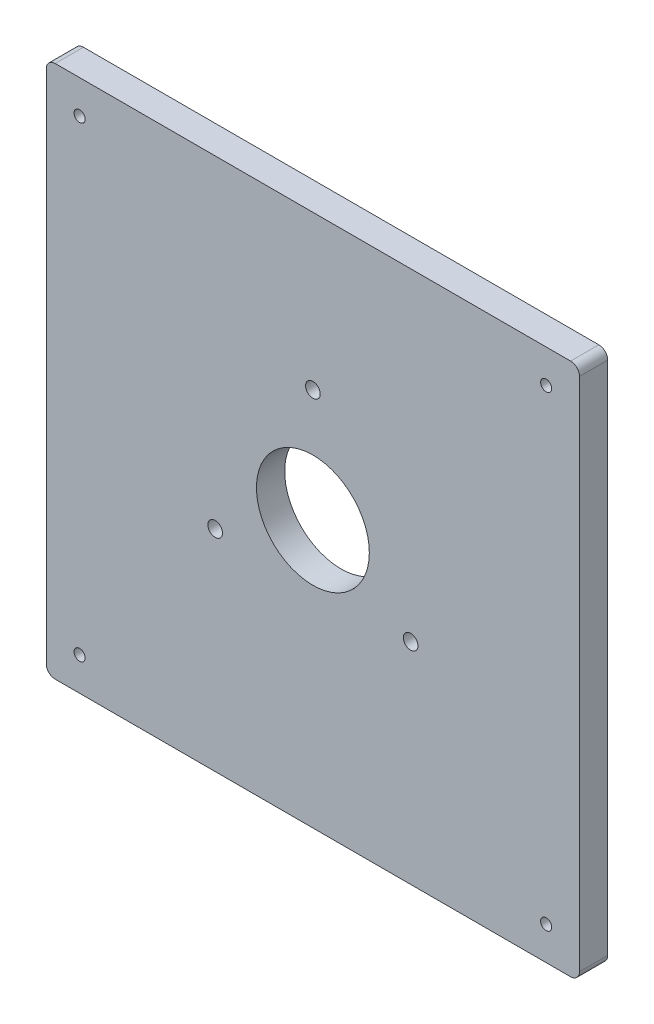
ISO-10303-21;
HEADER;
FILE_DESCRIPTION(('STEP AP214'),'2;1');
FILE_NAME('part.step','',(''),(''),'','','');
FILE_SCHEMA(('AUTOMOTIVE_DESIGN { 1 0 10303 214 1 1 1 1 }'));
ENDSEC;
DATA;
#1=APPLICATION_CONTEXT('core data for automotive mechanical design processes');
#2=APPLICATION_PROTOCOL_DEFINITION('international standard','automotive_design',2000,#1);
#3=PRODUCT_CONTEXT('',#1,'mechanical');
#4=PRODUCT('Part','Part','',(#3));
#5=PRODUCT_RELATED_PRODUCT_CATEGORY('part','',(#4));
#6=PRODUCT_DEFINITION_FORMATION('','',#4);
#7=PRODUCT_DEFINITION_CONTEXT('part definition',#1,'design');
#8=PRODUCT_DEFINITION('design','',#6,#7);
#9=PRODUCT_DEFINITION_SHAPE('','',#8);
#10=(LENGTH_UNIT() NAMED_UNIT(*) SI_UNIT(.MILLI.,.METRE.));
#11=(NAMED_UNIT(*) PLANE_ANGLE_UNIT() SI_UNIT($,.RADIAN.));
#12=(NAMED_UNIT(*) SI_UNIT($,.STERADIAN.) SOLID_ANGLE_UNIT());
#13=UNCERTAINTY_MEASURE_WITH_UNIT(LENGTH_MEASURE(1.E-05),#10,'distance_accuracy_value','');
#14=(GEOMETRIC_REPRESENTATION_CONTEXT(3) GLOBAL_UNCERTAINTY_ASSIGNED_CONTEXT((#13)) GLOBAL_UNIT_ASSIGNED_CONTEXT((#10,
#11,#12)) REPRESENTATION_CONTEXT('',''));
#15=CARTESIAN_POINT('',(0.,0.,0.));
#16=DIRECTION('',(0.,0.,1.));
#17=DIRECTION('',(1.,0.,0.));
#18=AXIS2_PLACEMENT_3D('',#15,#16,#17);
#19=CARTESIAN_POINT('',(0.,0.,6.35));
#20=DIRECTION('',(0.,0.,-1.));
#21=DIRECTION('',(-1.,0.,0.));
#22=AXIS2_PLACEMENT_3D('',#19,#20,#21);
#23=PLANE('',#22);
#24=CARTESIAN_POINT('',(81.9970452561247,47.2999999999999,6.35));
#25=DIRECTION('',(0.,0.,1.));
#26=DIRECTION('',(1.,0.,0.));
#27=AXIS2_PLACEMENT_3D('',#24,#25,#26);
#28=CIRCLE('',#27,1.65000000000001);
#29=CARTESIAN_POINT('',(83.6470452561247,47.2999999999999,6.35));
#30=VERTEX_POINT('',#29);
#31=EDGE_CURVE('E364',#30,#30,#28,.T.);
#32=ORIENTED_EDGE('',*,*,#31,.F.);
#33=EDGE_LOOP('',(#32));
#34=FACE_BOUND('',#33,.T.);
#35=CARTESIAN_POINT('',(38.0029547438753,47.2999999999999,6.35));
#36=DIRECTION('',(0.,0.,1.));
#37=DIRECTION('',(1.,0.,0.));
#38=AXIS2_PLACEMENT_3D('',#35,#36,#37);
#39=CIRCLE('',#38,1.65);
#40=CARTESIAN_POINT('',(39.6529547438753,47.2999999999999,6.35));
#41=VERTEX_POINT('',#40);
#42=EDGE_CURVE('E365',#41,#41,#39,.T.);
#43=ORIENTED_EDGE('',*,*,#42,.F.);
#44=EDGE_LOOP('',(#43));
#45=FACE_BOUND('',#44,.T.);
#46=CARTESIAN_POINT('',(60.,85.4,6.35));
#47=DIRECTION('',(0.,0.,1.));
#48=DIRECTION('',(1.,0.,0.));
#49=AXIS2_PLACEMENT_3D('',#46,#47,#48);
#50=CIRCLE('',#49,1.65);
#51=CARTESIAN_POINT('',(61.65,85.4,6.35));
#52=VERTEX_POINT('',#51);
#53=EDGE_CURVE('E373',#52,#52,#50,.T.);
#54=ORIENTED_EDGE('',*,*,#53,.F.);
#55=EDGE_LOOP('',(#54));
#56=FACE_BOUND('',#55,.T.);
#57=DIRECTION('',(0.,-1.,0.));
#58=VECTOR('',#57,1.);
#59=CARTESIAN_POINT('',(0.,0.,6.35));
#60=LINE('',#59,#58);
#61=CARTESIAN_POINT('',(0.,118.,6.35));
#62=VERTEX_POINT('',#61);
#63=CARTESIAN_POINT('',(0.,2.,6.35));
#64=VERTEX_POINT('',#63);
#65=EDGE_CURVE('E137',#62,#64,#60,.T.);
#66=ORIENTED_EDGE('',*,*,#65,.T.);
#67=CARTESIAN_POINT('',(2.,2.,6.35));
#68=DIRECTION('',(0.,0.,-1.));
#69=DIRECTION('',(-1.,0.,0.));
#70=AXIS2_PLACEMENT_3D('',#67,#68,#69);
#71=CIRCLE('',#70,2.);
#72=CARTESIAN_POINT('',(2.,0.,6.35));
#73=VERTEX_POINT('',#72);
#74=EDGE_CURVE('E152',#64,#73,#71,.F.);
#75=ORIENTED_EDGE('',*,*,#74,.T.);
#76=DIRECTION('',(1.,0.,0.));
#77=VECTOR('',#76,1.);
#78=CARTESIAN_POINT('',(0.,0.,6.35));
#79=LINE('',#78,#77);
#80=CARTESIAN_POINT('',(118.,0.,6.35));
#81=VERTEX_POINT('',#80);
#82=EDGE_CURVE('E119',#73,#81,#79,.T.);
#83=ORIENTED_EDGE('',*,*,#82,.T.);
#84=CARTESIAN_POINT('',(118.,2.,6.35));
#85=DIRECTION('',(0.,0.,-1.));
#86=DIRECTION('',(-1.,0.,0.));
#87=AXIS2_PLACEMENT_3D('',#84,#85,#86);
#88=CIRCLE('',#87,2.);
#89=CARTESIAN_POINT('',(120.,2.,6.35));
#90=VERTEX_POINT('',#89);
#91=EDGE_CURVE('E150',#81,#90,#88,.F.);
#92=ORIENTED_EDGE('',*,*,#91,.T.);
#93=DIRECTION('',(0.,1.,0.));
#94=VECTOR('',#93,1.);
#95=CARTESIAN_POINT('',(120.,0.,6.35));
#96=LINE('',#95,#94);
#97=CARTESIAN_POINT('',(120.,118.,6.35));
#98=VERTEX_POINT('',#97);
#99=EDGE_CURVE('E172',#90,#98,#96,.T.);
#100=ORIENTED_EDGE('',*,*,#99,.T.);
#101=CARTESIAN_POINT('',(118.,118.,6.35));
#102=DIRECTION('',(0.,0.,-1.));
#103=DIRECTION('',(-1.,0.,0.));
#104=AXIS2_PLACEMENT_3D('',#101,#102,#103);
#105=CIRCLE('',#104,2.);
#106=CARTESIAN_POINT('',(118.,120.,6.35));
#107=VERTEX_POINT('',#106);
#108=EDGE_CURVE('E54',#98,#107,#105,.F.);
#109=ORIENTED_EDGE('',*,*,#108,.T.);
#110=DIRECTION('',(-1.,0.,0.));
#111=VECTOR('',#110,1.);
#112=CARTESIAN_POINT('',(0.,120.,6.35));
#113=LINE('',#112,#111);
#114=CARTESIAN_POINT('',(2.,120.,6.35));
#115=VERTEX_POINT('',#114);
#116=EDGE_CURVE('E138',#107,#115,#113,.T.);
#117=ORIENTED_EDGE('',*,*,#116,.T.);
#118=CARTESIAN_POINT('',(2.,118.,6.35));
#119=DIRECTION('',(0.,0.,-1.));
#120=DIRECTION('',(-1.,0.,0.));
#121=AXIS2_PLACEMENT_3D('',#118,#119,#120);
#122=CIRCLE('',#121,2.);
#123=EDGE_CURVE('E148',#115,#62,#122,.F.);
#124=ORIENTED_EDGE('',*,*,#123,.T.);
#125=EDGE_LOOP('',(#66,#75,#83,#92,#100,#109,#117,#124));
#126=FACE_BOUND('',#125,.T.);
#127=CARTESIAN_POINT('',(7.5,112.5,6.35));
#128=DIRECTION('',(0.,0.,1.));
#129=DIRECTION('',(1.,0.,0.));
#130=AXIS2_PLACEMENT_3D('',#127,#128,#129);
#131=CIRCLE('',#130,1.25);
#132=CARTESIAN_POINT('',(8.75,112.5,6.35));
#133=VERTEX_POINT('',#132);
#134=EDGE_CURVE('E132',#133,#133,#131,.T.);
#135=ORIENTED_EDGE('',*,*,#134,.F.);
#136=EDGE_LOOP('',(#135));
#137=FACE_BOUND('',#136,.T.);
#138=CARTESIAN_POINT('',(112.5,112.5,6.35));
#139=DIRECTION('',(0.,0.,1.));
#140=DIRECTION('',(-1.,0.,0.));
#141=AXIS2_PLACEMENT_3D('',#138,#139,#140);
#142=CIRCLE('',#141,1.24999999999998);
#143=CARTESIAN_POINT('',(111.25,112.5,6.35));
#144=VERTEX_POINT('',#143);
#145=EDGE_CURVE('E188',#144,#144,#142,.T.);
#146=ORIENTED_EDGE('',*,*,#145,.F.);
#147=EDGE_LOOP('',(#146));
#148=FACE_BOUND('',#147,.T.);
#149=CARTESIAN_POINT('',(112.5,7.49999999999999,6.35));
#150=DIRECTION('',(0.,0.,1.));
#151=DIRECTION('',(1.,0.,0.));
#152=AXIS2_PLACEMENT_3D('',#149,#150,#151);
#153=CIRCLE('',#152,1.24999999999998);
#154=CARTESIAN_POINT('',(113.75,7.49999999999999,6.35));
#155=VERTEX_POINT('',#154);
#156=EDGE_CURVE('E192',#155,#155,#153,.T.);
#157=ORIENTED_EDGE('',*,*,#156,.F.);
#158=EDGE_LOOP('',(#157));
#159=FACE_BOUND('',#158,.T.);
#160=CARTESIAN_POINT('',(7.5,7.49999999999999,6.35));
#161=DIRECTION('',(0.,0.,1.));
#162=DIRECTION('',(-1.,0.,0.));
#163=AXIS2_PLACEMENT_3D('',#160,#161,#162);
#164=CIRCLE('',#163,1.25);
#165=CARTESIAN_POINT('',(6.25,7.49999999999999,6.35));
#166=VERTEX_POINT('',#165);
#167=EDGE_CURVE('E196',#166,#166,#164,.T.);
#168=ORIENTED_EDGE('',*,*,#167,.F.);
#169=EDGE_LOOP('',(#168));
#170=FACE_BOUND('',#169,.T.);
#171=CARTESIAN_POINT('',(60.,60.,6.35));
#172=DIRECTION('',(0.,0.,1.));
#173=DIRECTION('',(1.,0.,0.));
#174=AXIS2_PLACEMENT_3D('',#171,#172,#173);
#175=CIRCLE('',#174,12.7);
#176=CARTESIAN_POINT('',(72.7,60.,6.35));
#177=VERTEX_POINT('',#176);
#178=EDGE_CURVE('E199',#177,#177,#175,.T.);
#179=ORIENTED_EDGE('',*,*,#178,.F.);
#180=EDGE_LOOP('',(#179));
#181=FACE_BOUND('',#180,.T.);
#182=ADVANCED_FACE('F34',(#34,#45,#56,#126,#137,#148,#159,#170,#181),#23,.F.);
#183=CARTESIAN_POINT('',(0.,0.,0.));
#184=DIRECTION('',(0.,0.,-1.));
#185=DIRECTION('',(-1.,0.,0.));
#186=AXIS2_PLACEMENT_3D('',#183,#184,#185);
#187=PLANE('',#186);
#188=CARTESIAN_POINT('',(81.9970452561247,47.2999999999999,0.));
#189=DIRECTION('',(0.,0.,1.));
#190=DIRECTION('',(1.,0.,0.));
#191=AXIS2_PLACEMENT_3D('',#188,#189,#190);
#192=CIRCLE('',#191,1.65000000000001);
#193=CARTESIAN_POINT('',(83.6470452561247,47.2999999999999,0.));
#194=VERTEX_POINT('',#193);
#195=EDGE_CURVE('E207',#194,#194,#192,.T.);
#196=ORIENTED_EDGE('',*,*,#195,.T.);
#197=EDGE_LOOP('',(#196));
#198=FACE_BOUND('',#197,.T.);
#199=CARTESIAN_POINT('',(38.0029547438753,47.2999999999999,0.));
#200=DIRECTION('',(0.,0.,1.));
#201=DIRECTION('',(1.,0.,0.));
#202=AXIS2_PLACEMENT_3D('',#199,#200,#201);
#203=CIRCLE('',#202,1.65);
#204=CARTESIAN_POINT('',(39.6529547438753,47.2999999999999,0.));
#205=VERTEX_POINT('',#204);
#206=EDGE_CURVE('E369',#205,#205,#203,.T.);
#207=ORIENTED_EDGE('',*,*,#206,.T.);
#208=EDGE_LOOP('',(#207));
#209=FACE_BOUND('',#208,.T.);
#210=CARTESIAN_POINT('',(60.,85.4,0.));
#211=DIRECTION('',(0.,0.,1.));
#212=DIRECTION('',(1.,0.,0.));
#213=AXIS2_PLACEMENT_3D('',#210,#211,#212);
#214=CIRCLE('',#213,1.65);
#215=CARTESIAN_POINT('',(61.65,85.4,0.));
#216=VERTEX_POINT('',#215);
#217=EDGE_CURVE('E210',#216,#216,#214,.T.);
#218=ORIENTED_EDGE('',*,*,#217,.T.);
#219=EDGE_LOOP('',(#218));
#220=FACE_BOUND('',#219,.T.);
#221=CARTESIAN_POINT('',(7.5,7.49999999999999,0.));
#222=DIRECTION('',(0.,0.,1.));
#223=DIRECTION('',(-1.,0.,0.));
#224=AXIS2_PLACEMENT_3D('',#221,#222,#223);
#225=CIRCLE('',#224,1.25);
#226=CARTESIAN_POINT('',(6.25,7.49999999999999,0.));
#227=VERTEX_POINT('',#226);
#228=EDGE_CURVE('E201',#227,#227,#225,.T.);
#229=ORIENTED_EDGE('',*,*,#228,.T.);
#230=EDGE_LOOP('',(#229));
#231=FACE_BOUND('',#230,.T.);
#232=CARTESIAN_POINT('',(112.5,112.5,0.));
#233=DIRECTION('',(0.,0.,1.));
#234=DIRECTION('',(-1.,0.,0.));
#235=AXIS2_PLACEMENT_3D('',#232,#233,#234);
#236=CIRCLE('',#235,1.24999999999998);
#237=CARTESIAN_POINT('',(111.25,112.5,0.));
#238=VERTEX_POINT('',#237);
#239=EDGE_CURVE('E216',#238,#238,#236,.T.);
#240=ORIENTED_EDGE('',*,*,#239,.T.);
#241=EDGE_LOOP('',(#240));
#242=FACE_BOUND('',#241,.T.);
#243=DIRECTION('',(1.,0.,0.));
#244=VECTOR('',#243,1.);
#245=CARTESIAN_POINT('',(0.,0.,0.));
#246=LINE('',#245,#244);
#247=CARTESIAN_POINT('',(2.,0.,0.));
#248=VERTEX_POINT('',#247);
#249=CARTESIAN_POINT('',(118.,0.,0.));
#250=VERTEX_POINT('',#249);
#251=EDGE_CURVE('E116',#248,#250,#246,.T.);
#252=ORIENTED_EDGE('',*,*,#251,.F.);
#253=CARTESIAN_POINT('',(2.,2.,0.));
#254=DIRECTION('',(0.,0.,-1.));
#255=DIRECTION('',(-1.,0.,0.));
#256=AXIS2_PLACEMENT_3D('',#253,#254,#255);
#257=CIRCLE('',#256,2.);
#258=CARTESIAN_POINT('',(0.,2.,0.));
#259=VERTEX_POINT('',#258);
#260=EDGE_CURVE('E99',#248,#259,#257,.T.);
#261=ORIENTED_EDGE('',*,*,#260,.T.);
#262=DIRECTION('',(0.,-1.,0.));
#263=VECTOR('',#262,1.);
#264=CARTESIAN_POINT('',(0.,0.,0.));
#265=LINE('',#264,#263);
#266=CARTESIAN_POINT('',(0.,118.,0.));
#267=VERTEX_POINT('',#266);
#268=EDGE_CURVE('E127',#267,#259,#265,.T.);
#269=ORIENTED_EDGE('',*,*,#268,.F.);
#270=CARTESIAN_POINT('',(2.,118.,0.));
#271=DIRECTION('',(0.,0.,-1.));
#272=DIRECTION('',(-1.,0.,0.));
#273=AXIS2_PLACEMENT_3D('',#270,#271,#272);
#274=CIRCLE('',#273,2.);
#275=CARTESIAN_POINT('',(2.,120.,0.));
#276=VERTEX_POINT('',#275);
#277=EDGE_CURVE('E141',#267,#276,#274,.T.);
#278=ORIENTED_EDGE('',*,*,#277,.T.);
#279=DIRECTION('',(-1.,0.,0.));
#280=VECTOR('',#279,1.);
#281=CARTESIAN_POINT('',(0.,120.,0.));
#282=LINE('',#281,#280);
#283=CARTESIAN_POINT('',(118.,120.,0.));
#284=VERTEX_POINT('',#283);
#285=EDGE_CURVE('E130',#284,#276,#282,.T.);
#286=ORIENTED_EDGE('',*,*,#285,.F.);
#287=CARTESIAN_POINT('',(118.,118.,0.));
#288=DIRECTION('',(0.,0.,-1.));
#289=DIRECTION('',(-1.,0.,0.));
#290=AXIS2_PLACEMENT_3D('',#287,#288,#289);
#291=CIRCLE('',#290,2.);
#292=CARTESIAN_POINT('',(120.,118.,0.));
#293=VERTEX_POINT('',#292);
#294=EDGE_CURVE('E120',#284,#293,#291,.T.);
#295=ORIENTED_EDGE('',*,*,#294,.T.);
#296=DIRECTION('',(0.,1.,0.));
#297=VECTOR('',#296,1.);
#298=CARTESIAN_POINT('',(120.,0.,0.));
#299=LINE('',#298,#297);
#300=CARTESIAN_POINT('',(120.,2.,0.));
#301=VERTEX_POINT('',#300);
#302=EDGE_CURVE('E126',#301,#293,#299,.T.);
#303=ORIENTED_EDGE('',*,*,#302,.F.);
#304=CARTESIAN_POINT('',(118.,2.,0.));
#305=DIRECTION('',(0.,0.,-1.));
#306=DIRECTION('',(-1.,0.,0.));
#307=AXIS2_PLACEMENT_3D('',#304,#305,#306);
#308=CIRCLE('',#307,2.);
#309=EDGE_CURVE('E110',#301,#250,#308,.T.);
#310=ORIENTED_EDGE('',*,*,#309,.T.);
#311=EDGE_LOOP('',(#252,#261,#269,#278,#286,#295,#303,#310));
#312=FACE_BOUND('',#311,.T.);
#313=CARTESIAN_POINT('',(7.5,112.5,0.));
#314=DIRECTION('',(0.,0.,1.));
#315=DIRECTION('',(1.,0.,0.));
#316=AXIS2_PLACEMENT_3D('',#313,#314,#315);
#317=CIRCLE('',#316,1.25);
#318=CARTESIAN_POINT('',(8.75,112.5,0.));
#319=VERTEX_POINT('',#318);
#320=EDGE_CURVE('E175',#319,#319,#317,.T.);
#321=ORIENTED_EDGE('',*,*,#320,.T.);
#322=EDGE_LOOP('',(#321));
#323=FACE_BOUND('',#322,.T.);
#324=CARTESIAN_POINT('',(112.5,7.49999999999999,0.));
#325=DIRECTION('',(0.,0.,1.));
#326=DIRECTION('',(1.,0.,0.));
#327=AXIS2_PLACEMENT_3D('',#324,#325,#326);
#328=CIRCLE('',#327,1.24999999999998);
#329=CARTESIAN_POINT('',(113.75,7.49999999999999,0.));
#330=VERTEX_POINT('',#329);
#331=EDGE_CURVE('E213',#330,#330,#328,.T.);
#332=ORIENTED_EDGE('',*,*,#331,.T.);
#333=EDGE_LOOP('',(#332));
#334=FACE_BOUND('',#333,.T.);
#335=CARTESIAN_POINT('',(60.,60.,0.));
#336=DIRECTION('',(0.,0.,1.));
#337=DIRECTION('',(1.,0.,0.));
#338=AXIS2_PLACEMENT_3D('',#335,#336,#337);
#339=CIRCLE('',#338,12.7);
#340=CARTESIAN_POINT('',(72.7,60.,0.));
#341=VERTEX_POINT('',#340);
#342=EDGE_CURVE('E202',#341,#341,#339,.T.);
#343=ORIENTED_EDGE('',*,*,#342,.T.);
#344=EDGE_LOOP('',(#343));
#345=FACE_BOUND('',#344,.T.);
#346=ADVANCED_FACE('F123',(#198,#209,#220,#231,#242,#312,#323,#334,#345),#187,.T.);
#347=CARTESIAN_POINT('',(0.,0.,6.35));
#348=DIRECTION('',(1.,0.,0.));
#349=DIRECTION('',(0.,0.,-1.));
#350=AXIS2_PLACEMENT_3D('',#347,#348,#349);
#351=PLANE('',#350);
#352=ORIENTED_EDGE('',*,*,#268,.T.);
#353=DIRECTION('',(0.,0.,-1.));
#354=VECTOR('',#353,1.);
#355=CARTESIAN_POINT('',(0.,2.,6.35));
#356=LINE('',#355,#354);
#357=EDGE_CURVE('E104',#259,#64,#356,.F.);
#358=ORIENTED_EDGE('',*,*,#357,.T.);
#359=ORIENTED_EDGE('',*,*,#65,.F.);
#360=DIRECTION('',(0.,0.,-1.));
#361=VECTOR('',#360,1.);
#362=CARTESIAN_POINT('',(0.,118.,6.35));
#363=LINE('',#362,#361);
#364=EDGE_CURVE('E109',#62,#267,#363,.T.);
#365=ORIENTED_EDGE('',*,*,#364,.T.);
#366=EDGE_LOOP('',(#352,#358,#359,#365));
#367=FACE_BOUND('',#366,.T.);
#368=ADVANCED_FACE('F169',(#367),#351,.F.);
#369=CARTESIAN_POINT('',(0.,0.,6.35));
#370=DIRECTION('',(0.,1.,0.));
#371=DIRECTION('',(0.,0.,1.));
#372=AXIS2_PLACEMENT_3D('',#369,#370,#371);
#373=PLANE('',#372);
#374=ORIENTED_EDGE('',*,*,#82,.F.);
#375=DIRECTION('',(0.,0.,-1.));
#376=VECTOR('',#375,1.);
#377=CARTESIAN_POINT('',(2.,0.,6.35));
#378=LINE('',#377,#376);
#379=EDGE_CURVE('E103',#73,#248,#378,.T.);
#380=ORIENTED_EDGE('',*,*,#379,.T.);
#381=ORIENTED_EDGE('',*,*,#251,.T.);
#382=DIRECTION('',(0.,0.,-1.));
#383=VECTOR('',#382,1.);
#384=CARTESIAN_POINT('',(118.,0.,6.35));
#385=LINE('',#384,#383);
#386=EDGE_CURVE('E121',#250,#81,#385,.F.);
#387=ORIENTED_EDGE('',*,*,#386,.T.);
#388=EDGE_LOOP('',(#374,#380,#381,#387));
#389=FACE_BOUND('',#388,.T.);
#390=ADVANCED_FACE('F115',(#389),#373,.F.);
#391=CARTESIAN_POINT('',(120.,0.,6.35));
#392=DIRECTION('',(-1.,0.,0.));
#393=DIRECTION('',(0.,0.,1.));
#394=AXIS2_PLACEMENT_3D('',#391,#392,#393);
#395=PLANE('',#394);
#396=ORIENTED_EDGE('',*,*,#99,.F.);
#397=DIRECTION('',(0.,0.,-1.));
#398=VECTOR('',#397,1.);
#399=CARTESIAN_POINT('',(120.,2.,6.35));
#400=LINE('',#399,#398);
#401=EDGE_CURVE('E156',#90,#301,#400,.T.);
#402=ORIENTED_EDGE('',*,*,#401,.T.);
#403=ORIENTED_EDGE('',*,*,#302,.T.);
#404=DIRECTION('',(0.,0.,-1.));
#405=VECTOR('',#404,1.);
#406=CARTESIAN_POINT('',(120.,118.,6.35));
#407=LINE('',#406,#405);
#408=EDGE_CURVE('E154',#293,#98,#407,.F.);
#409=ORIENTED_EDGE('',*,*,#408,.T.);
#410=EDGE_LOOP('',(#396,#402,#403,#409));
#411=FACE_BOUND('',#410,.T.);
#412=ADVANCED_FACE('F237',(#411),#395,.F.);
#413=CARTESIAN_POINT('',(0.,120.,6.35));
#414=DIRECTION('',(0.,-1.,0.));
#415=DIRECTION('',(0.,0.,-1.));
#416=AXIS2_PLACEMENT_3D('',#413,#414,#415);
#417=PLANE('',#416);
#418=ORIENTED_EDGE('',*,*,#285,.T.);
#419=DIRECTION('',(0.,0.,-1.));
#420=VECTOR('',#419,1.);
#421=CARTESIAN_POINT('',(2.,120.,6.35));
#422=LINE('',#421,#420);
#423=EDGE_CURVE('E11',#276,#115,#422,.F.);
#424=ORIENTED_EDGE('',*,*,#423,.T.);
#425=ORIENTED_EDGE('',*,*,#116,.F.);
#426=DIRECTION('',(0.,0.,-1.));
#427=VECTOR('',#426,1.);
#428=CARTESIAN_POINT('',(118.,120.,6.35));
#429=LINE('',#428,#427);
#430=EDGE_CURVE('E42',#107,#284,#429,.T.);
#431=ORIENTED_EDGE('',*,*,#430,.T.);
#432=EDGE_LOOP('',(#418,#424,#425,#431));
#433=FACE_BOUND('',#432,.T.);
#434=ADVANCED_FACE('F161',(#433),#417,.F.);
#435=CARTESIAN_POINT('',(7.5,112.5,6.35));
#436=DIRECTION('',(0.,0.,-1.));
#437=DIRECTION('',(-1.,0.,0.));
#438=AXIS2_PLACEMENT_3D('',#435,#436,#437);
#439=CYLINDRICAL_SURFACE('',#438,1.25);
#440=ORIENTED_EDGE('',*,*,#134,.T.);
#441=EDGE_LOOP('',(#440));
#442=FACE_BOUND('',#441,.T.);
#443=ORIENTED_EDGE('',*,*,#320,.F.);
#444=EDGE_LOOP('',(#443));
#445=FACE_BOUND('',#444,.T.);
#446=ADVANCED_FACE('F226',(#442,#445),#439,.F.);
#447=CARTESIAN_POINT('',(112.5,112.5,6.35));
#448=DIRECTION('',(0.,0.,-1.));
#449=DIRECTION('',(-1.,0.,0.));
#450=AXIS2_PLACEMENT_3D('',#447,#448,#449);
#451=CYLINDRICAL_SURFACE('',#450,1.24999999999998);
#452=ORIENTED_EDGE('',*,*,#145,.T.);
#453=EDGE_LOOP('',(#452));
#454=FACE_BOUND('',#453,.T.);
#455=ORIENTED_EDGE('',*,*,#239,.F.);
#456=EDGE_LOOP('',(#455));
#457=FACE_BOUND('',#456,.T.);
#458=ADVANCED_FACE('F228',(#454,#457),#451,.F.);
#459=CARTESIAN_POINT('',(112.5,7.49999999999999,6.35));
#460=DIRECTION('',(0.,0.,-1.));
#461=DIRECTION('',(-1.,0.,0.));
#462=AXIS2_PLACEMENT_3D('',#459,#460,#461);
#463=CYLINDRICAL_SURFACE('',#462,1.24999999999998);
#464=ORIENTED_EDGE('',*,*,#156,.T.);
#465=EDGE_LOOP('',(#464));
#466=FACE_BOUND('',#465,.T.);
#467=ORIENTED_EDGE('',*,*,#331,.F.);
#468=EDGE_LOOP('',(#467));
#469=FACE_BOUND('',#468,.T.);
#470=ADVANCED_FACE('F234',(#466,#469),#463,.F.);
#471=CARTESIAN_POINT('',(7.5,7.49999999999999,6.35));
#472=DIRECTION('',(0.,0.,-1.));
#473=DIRECTION('',(-1.,0.,0.));
#474=AXIS2_PLACEMENT_3D('',#471,#472,#473);
#475=CYLINDRICAL_SURFACE('',#474,1.25);
#476=ORIENTED_EDGE('',*,*,#167,.T.);
#477=EDGE_LOOP('',(#476));
#478=FACE_BOUND('',#477,.T.);
#479=ORIENTED_EDGE('',*,*,#228,.F.);
#480=EDGE_LOOP('',(#479));
#481=FACE_BOUND('',#480,.T.);
#482=ADVANCED_FACE('F284',(#478,#481),#475,.F.);
#483=CARTESIAN_POINT('',(60.,60.,6.35));
#484=DIRECTION('',(0.,0.,-1.));
#485=DIRECTION('',(-1.,0.,0.));
#486=AXIS2_PLACEMENT_3D('',#483,#484,#485);
#487=CYLINDRICAL_SURFACE('',#486,12.7);
#488=ORIENTED_EDGE('',*,*,#178,.T.);
#489=EDGE_LOOP('',(#488));
#490=FACE_BOUND('',#489,.T.);
#491=ORIENTED_EDGE('',*,*,#342,.F.);
#492=EDGE_LOOP('',(#491));
#493=FACE_BOUND('',#492,.T.);
#494=ADVANCED_FACE('F254',(#490,#493),#487,.F.);
#495=CARTESIAN_POINT('',(2.,2.,6.35));
#496=DIRECTION('',(0.,0.,-1.));
#497=DIRECTION('',(-1.,0.,0.));
#498=AXIS2_PLACEMENT_3D('',#495,#496,#497);
#499=CYLINDRICAL_SURFACE('',#498,2.);
#500=ORIENTED_EDGE('',*,*,#74,.F.);
#501=ORIENTED_EDGE('',*,*,#357,.F.);
#502=ORIENTED_EDGE('',*,*,#260,.F.);
#503=ORIENTED_EDGE('',*,*,#379,.F.);
#504=EDGE_LOOP('',(#500,#501,#502,#503));
#505=FACE_BOUND('',#504,.T.);
#506=ADVANCED_FACE('F102',(#505),#499,.T.);
#507=CARTESIAN_POINT('',(118.,2.,6.35));
#508=DIRECTION('',(0.,0.,-1.));
#509=DIRECTION('',(-1.,0.,0.));
#510=AXIS2_PLACEMENT_3D('',#507,#508,#509);
#511=CYLINDRICAL_SURFACE('',#510,2.);
#512=ORIENTED_EDGE('',*,*,#91,.F.);
#513=ORIENTED_EDGE('',*,*,#386,.F.);
#514=ORIENTED_EDGE('',*,*,#309,.F.);
#515=ORIENTED_EDGE('',*,*,#401,.F.);
#516=EDGE_LOOP('',(#512,#513,#514,#515));
#517=FACE_BOUND('',#516,.T.);
#518=ADVANCED_FACE('F253',(#517),#511,.T.);
#519=CARTESIAN_POINT('',(2.,118.,6.35));
#520=DIRECTION('',(0.,0.,-1.));
#521=DIRECTION('',(-1.,0.,0.));
#522=AXIS2_PLACEMENT_3D('',#519,#520,#521);
#523=CYLINDRICAL_SURFACE('',#522,2.);
#524=ORIENTED_EDGE('',*,*,#123,.F.);
#525=ORIENTED_EDGE('',*,*,#423,.F.);
#526=ORIENTED_EDGE('',*,*,#277,.F.);
#527=ORIENTED_EDGE('',*,*,#364,.F.);
#528=EDGE_LOOP('',(#524,#525,#526,#527));
#529=FACE_BOUND('',#528,.T.);
#530=ADVANCED_FACE('F166',(#529),#523,.T.);
#531=CARTESIAN_POINT('',(118.,118.,6.35));
#532=DIRECTION('',(0.,0.,-1.));
#533=DIRECTION('',(-1.,0.,0.));
#534=AXIS2_PLACEMENT_3D('',#531,#532,#533);
#535=CYLINDRICAL_SURFACE('',#534,2.);
#536=ORIENTED_EDGE('',*,*,#108,.F.);
#537=ORIENTED_EDGE('',*,*,#408,.F.);
#538=ORIENTED_EDGE('',*,*,#294,.F.);
#539=ORIENTED_EDGE('',*,*,#430,.F.);
#540=EDGE_LOOP('',(#536,#537,#538,#539));
#541=FACE_BOUND('',#540,.T.);
#542=ADVANCED_FACE('F36',(#541),#535,.T.);
#543=CARTESIAN_POINT('',(60.,85.4,0.));
#544=DIRECTION('',(0.,0.,1.));
#545=DIRECTION('',(1.,0.,0.));
#546=AXIS2_PLACEMENT_3D('',#543,#544,#545);
#547=CYLINDRICAL_SURFACE('',#546,1.65);
#548=ORIENTED_EDGE('',*,*,#217,.F.);
#549=EDGE_LOOP('',(#548));
#550=FACE_BOUND('',#549,.T.);
#551=ORIENTED_EDGE('',*,*,#53,.T.);
#552=EDGE_LOOP('',(#551));
#553=FACE_BOUND('',#552,.T.);
#554=ADVANCED_FACE('F261',(#550,#553),#547,.F.);
#555=CARTESIAN_POINT('',(38.0029547438753,47.2999999999999,0.));
#556=DIRECTION('',(0.,0.,1.));
#557=DIRECTION('',(1.,0.,0.));
#558=AXIS2_PLACEMENT_3D('',#555,#556,#557);
#559=CYLINDRICAL_SURFACE('',#558,1.65);
#560=ORIENTED_EDGE('',*,*,#206,.F.);
#561=EDGE_LOOP('',(#560));
#562=FACE_BOUND('',#561,.T.);
#563=ORIENTED_EDGE('',*,*,#42,.T.);
#564=EDGE_LOOP('',(#563));
#565=FACE_BOUND('',#564,.T.);
#566=ADVANCED_FACE('F265',(#562,#565),#559,.F.);
#567=CARTESIAN_POINT('',(81.9970452561247,47.2999999999999,0.));
#568=DIRECTION('',(0.,0.,1.));
#569=DIRECTION('',(1.,0.,0.));
#570=AXIS2_PLACEMENT_3D('',#567,#568,#569);
#571=CYLINDRICAL_SURFACE('',#570,1.65000000000001);
#572=ORIENTED_EDGE('',*,*,#195,.F.);
#573=EDGE_LOOP('',(#572));
#574=FACE_BOUND('',#573,.T.);
#575=ORIENTED_EDGE('',*,*,#31,.T.);
#576=EDGE_LOOP('',(#575));
#577=FACE_BOUND('',#576,.T.);
#578=ADVANCED_FACE('F275',(#574,#577),#571,.F.);
#579=CLOSED_SHELL('',(#182,#346,#368,#390,#412,#434,#446,#458,#470,#482,#494,#506,#518,#530,
#542,#554,#566,#578));
#580=MANIFOLD_SOLID_BREP('B2',#579);
#581=ADVANCED_BREP_SHAPE_REPRESENTATION('',(#18,#580),#14);
#582=SHAPE_DEFINITION_REPRESENTATION(#9,#581);
ENDSEC;
END-ISO-10303-21;
